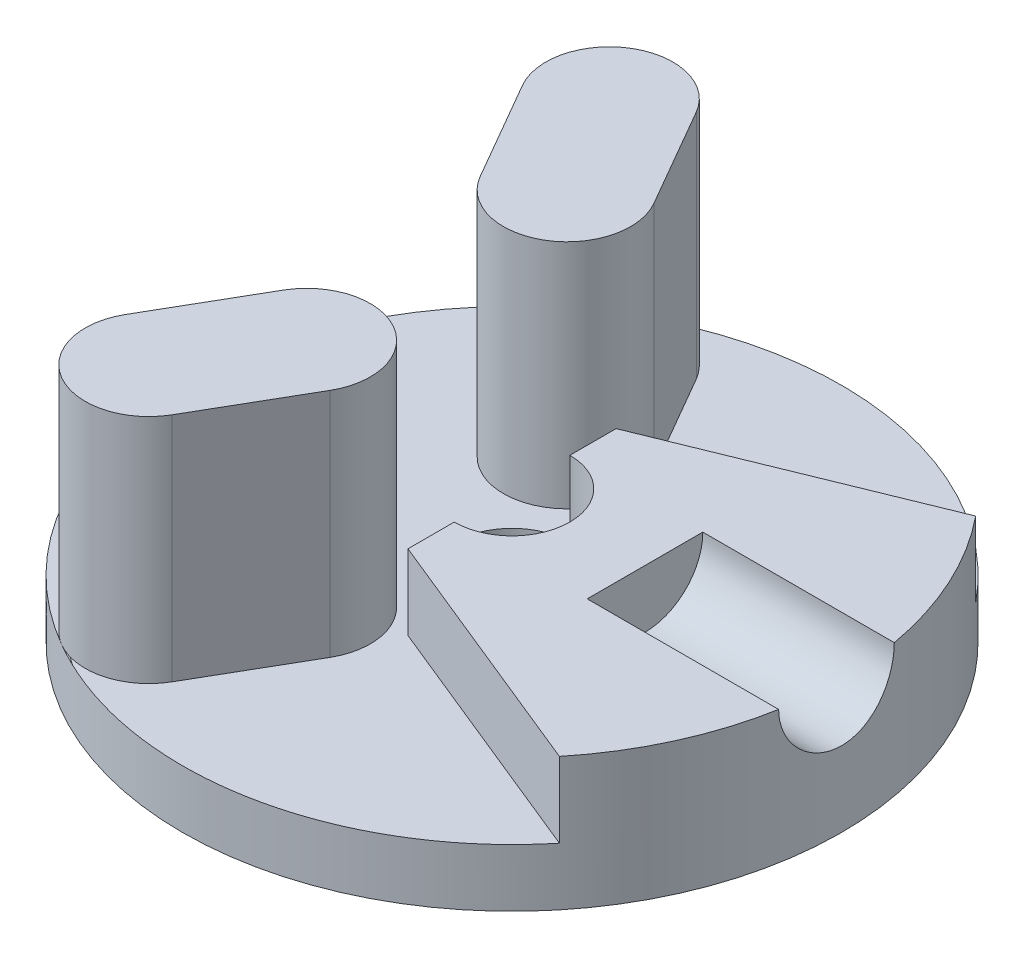
ISO-10303-21;
HEADER;
FILE_DESCRIPTION(('STEP AP214'),'2;1');
FILE_NAME('part.step','',(''),(''),'','','');
FILE_SCHEMA(('AUTOMOTIVE_DESIGN { 1 0 10303 214 1 1 1 1 }'));
ENDSEC;
DATA;
#1=APPLICATION_CONTEXT('core data for automotive mechanical design processes');
#2=APPLICATION_PROTOCOL_DEFINITION('international standard','automotive_design',2000,#1);
#3=PRODUCT_CONTEXT('',#1,'mechanical');
#4=PRODUCT('Part','Part','',(#3));
#5=PRODUCT_RELATED_PRODUCT_CATEGORY('part','',(#4));
#6=PRODUCT_DEFINITION_FORMATION('','',#4);
#7=PRODUCT_DEFINITION_CONTEXT('part definition',#1,'design');
#8=PRODUCT_DEFINITION('design','',#6,#7);
#9=PRODUCT_DEFINITION_SHAPE('','',#8);
#10=(LENGTH_UNIT() NAMED_UNIT(*) SI_UNIT(.MILLI.,.METRE.));
#11=(NAMED_UNIT(*) PLANE_ANGLE_UNIT() SI_UNIT($,.RADIAN.));
#12=(NAMED_UNIT(*) SI_UNIT($,.STERADIAN.) SOLID_ANGLE_UNIT());
#13=UNCERTAINTY_MEASURE_WITH_UNIT(LENGTH_MEASURE(1.E-05),#10,'distance_accuracy_value','');
#14=(GEOMETRIC_REPRESENTATION_CONTEXT(3) GLOBAL_UNCERTAINTY_ASSIGNED_CONTEXT((#13)) GLOBAL_UNIT_ASSIGNED_CONTEXT((#10,
#11,#12)) REPRESENTATION_CONTEXT('',''));
#15=CARTESIAN_POINT('',(0.,0.,0.));
#16=DIRECTION('',(0.,0.,1.));
#17=DIRECTION('',(1.,0.,0.));
#18=AXIS2_PLACEMENT_3D('',#15,#16,#17);
#19=CARTESIAN_POINT('',(0.,5.,0.));
#20=DIRECTION('',(0.,1.,0.));
#21=DIRECTION('',(0.,0.,1.));
#22=AXIS2_PLACEMENT_3D('',#19,#20,#21);
#23=PLANE('',#22);
#24=DIRECTION('',(0.500000000000004,0.,-0.866025403784436));
#25=VECTOR('',#24,1.);
#26=CARTESIAN_POINT('',(-6.73686027918569,5.,22.6685842870421));
#27=LINE('',#26,#25);
#28=CARTESIAN_POINT('',(-6.73686027918569,5.,22.6685842870421));
#29=VERTEX_POINT('',#28);
#30=CARTESIAN_POINT('',(-1.73686027918565,5.,14.0083302491977));
#31=VERTEX_POINT('',#30);
#32=EDGE_CURVE('E355',#29,#31,#27,.T.);
#33=ORIENTED_EDGE('',*,*,#32,.F.);
#34=CARTESIAN_POINT('',(-11.5000000000001,5.,19.918584287042));
#35=DIRECTION('',(0.,1.,0.));
#36=DIRECTION('',(0.,0.,-1.));
#37=AXIS2_PLACEMENT_3D('',#34,#35,#36);
#38=CIRCLE('',#37,5.5);
#39=CARTESIAN_POINT('',(-14.2500000000001,5.,24.6817240078564));
#40=VERTEX_POINT('',#39);
#41=EDGE_CURVE('E181',#40,#29,#38,.T.);
#42=ORIENTED_EDGE('',*,*,#41,.F.);
#43=CARTESIAN_POINT('',(0.,5.,0.));
#44=DIRECTION('',(0.,1.,0.));
#45=DIRECTION('',(0.,0.,1.));
#46=AXIS2_PLACEMENT_3D('',#43,#44,#45);
#47=CIRCLE('',#46,28.5);
#48=CARTESIAN_POINT('',(22.0963797939844,5.,18.));
#49=VERTEX_POINT('',#48);
#50=EDGE_CURVE('E275',#40,#49,#47,.T.);
#51=ORIENTED_EDGE('',*,*,#50,.T.);
#52=DIRECTION('',(0.926124996899135,0.,0.377216768077159));
#53=VECTOR('',#52,1.);
#54=CARTESIAN_POINT('',(0.,5.,9.));
#55=LINE('',#54,#53);
#56=CARTESIAN_POINT('',(0.,5.,9.));
#57=VERTEX_POINT('',#56);
#58=EDGE_CURVE('E406',#57,#49,#55,.T.);
#59=ORIENTED_EDGE('',*,*,#58,.F.);
#60=DIRECTION('',(0.,0.,1.));
#61=VECTOR('',#60,1.);
#62=CARTESIAN_POINT('',(0.,5.,9.));
#63=LINE('',#62,#61);
#64=CARTESIAN_POINT('',(0.,5.,5.));
#65=VERTEX_POINT('',#64);
#66=EDGE_CURVE('E403',#65,#57,#63,.T.);
#67=ORIENTED_EDGE('',*,*,#66,.F.);
#68=CARTESIAN_POINT('',(0.,5.,0.));
#69=DIRECTION('',(0.,1.,0.));
#70=DIRECTION('',(0.,0.,1.));
#71=AXIS2_PLACEMENT_3D('',#68,#69,#70);
#72=CIRCLE('',#71,5.);
#73=CARTESIAN_POINT('',(0.,5.,-5.));
#74=VERTEX_POINT('',#73);
#75=EDGE_CURVE('E276',#74,#65,#72,.T.);
#76=ORIENTED_EDGE('',*,*,#75,.F.);
#77=DIRECTION('',(0.,0.,1.));
#78=VECTOR('',#77,1.);
#79=CARTESIAN_POINT('',(0.,5.,-5.));
#80=LINE('',#79,#78);
#81=CARTESIAN_POINT('',(0.,5.,-9.));
#82=VERTEX_POINT('',#81);
#83=EDGE_CURVE('E223',#82,#74,#80,.T.);
#84=ORIENTED_EDGE('',*,*,#83,.F.);
#85=DIRECTION('',(-0.926124996899135,0.,0.377216768077159));
#86=VECTOR('',#85,1.);
#87=CARTESIAN_POINT('',(0.,5.,-9.));
#88=LINE('',#87,#86);
#89=CARTESIAN_POINT('',(22.0963797939844,5.,-18.));
#90=VERTEX_POINT('',#89);
#91=EDGE_CURVE('E373',#90,#82,#88,.T.);
#92=ORIENTED_EDGE('',*,*,#91,.F.);
#93=CARTESIAN_POINT('',(-14.2500000000001,5.,-24.6817240078564));
#94=VERTEX_POINT('',#93);
#95=EDGE_CURVE('E280',#90,#94,#47,.T.);
#96=ORIENTED_EDGE('',*,*,#95,.T.);
#97=CARTESIAN_POINT('',(-11.5000000000001,5.,-19.918584287042));
#98=DIRECTION('',(0.,1.,0.));
#99=DIRECTION('',(0.,0.,1.));
#100=AXIS2_PLACEMENT_3D('',#97,#98,#99);
#101=CIRCLE('',#100,5.5);
#102=CARTESIAN_POINT('',(-6.73686027918569,5.,-22.6685842870421));
#103=VERTEX_POINT('',#102);
#104=EDGE_CURVE('E184',#103,#94,#101,.T.);
#105=ORIENTED_EDGE('',*,*,#104,.F.);
#106=DIRECTION('',(-0.500000000000004,0.,-0.866025403784436));
#107=VECTOR('',#106,1.);
#108=CARTESIAN_POINT('',(-6.73686027918569,5.,-22.6685842870421));
#109=LINE('',#108,#107);
#110=CARTESIAN_POINT('',(-1.73686027918565,5.,-14.0083302491977));
#111=VERTEX_POINT('',#110);
#112=EDGE_CURVE('E193',#111,#103,#109,.T.);
#113=ORIENTED_EDGE('',*,*,#112,.F.);
#114=CARTESIAN_POINT('',(-6.50000000000006,5.,-11.2583302491977));
#115=DIRECTION('',(0.,1.,0.));
#116=DIRECTION('',(0.,0.,1.));
#117=AXIS2_PLACEMENT_3D('',#114,#115,#116);
#118=CIRCLE('',#117,5.5);
#119=CARTESIAN_POINT('',(-11.2631397208145,5.,-8.50833024919765));
#120=VERTEX_POINT('',#119);
#121=EDGE_CURVE('E202',#120,#111,#118,.T.);
#122=ORIENTED_EDGE('',*,*,#121,.F.);
#123=DIRECTION('',(0.500000000000004,0.,0.866025403784436));
#124=VECTOR('',#123,1.);
#125=CARTESIAN_POINT('',(-16.2631397208145,5.,-17.168584287042));
#126=LINE('',#125,#124);
#127=CARTESIAN_POINT('',(-16.2631397208145,5.,-17.168584287042));
#128=VERTEX_POINT('',#127);
#129=EDGE_CURVE('E200',#128,#120,#126,.T.);
#130=ORIENTED_EDGE('',*,*,#129,.F.);
#131=EDGE_CURVE('E182',#94,#128,#101,.T.);
#132=ORIENTED_EDGE('',*,*,#131,.F.);
#133=EDGE_CURVE('E278',#94,#40,#47,.T.);
#134=ORIENTED_EDGE('',*,*,#133,.T.);
#135=CARTESIAN_POINT('',(-16.2631397208145,5.,17.168584287042));
#136=VERTEX_POINT('',#135);
#137=EDGE_CURVE('E353',#136,#40,#38,.T.);
#138=ORIENTED_EDGE('',*,*,#137,.F.);
#139=DIRECTION('',(-0.500000000000004,0.,0.866025403784436));
#140=VECTOR('',#139,1.);
#141=CARTESIAN_POINT('',(-16.2631397208145,5.,17.168584287042));
#142=LINE('',#141,#140);
#143=CARTESIAN_POINT('',(-11.2631397208145,5.,8.50833024919765));
#144=VERTEX_POINT('',#143);
#145=EDGE_CURVE('E177',#144,#136,#142,.T.);
#146=ORIENTED_EDGE('',*,*,#145,.F.);
#147=CARTESIAN_POINT('',(-6.50000000000006,5.,11.2583302491977));
#148=DIRECTION('',(0.,1.,0.));
#149=DIRECTION('',(0.,0.,-1.));
#150=AXIS2_PLACEMENT_3D('',#147,#148,#149);
#151=CIRCLE('',#150,5.5);
#152=EDGE_CURVE('E357',#31,#144,#151,.T.);
#153=ORIENTED_EDGE('',*,*,#152,.F.);
#154=EDGE_LOOP('',(#33,#42,#51,#59,#67,#76,#84,#92,#96,#105,#113,#122,#130,#132,#134,#138,#146,#153));
#155=FACE_BOUND('',#154,.T.);
#156=ADVANCED_FACE('F35',(#155),#23,.T.);
#157=CARTESIAN_POINT('',(0.,0.,0.));
#158=DIRECTION('',(0.,1.,0.));
#159=DIRECTION('',(0.,0.,1.));
#160=AXIS2_PLACEMENT_3D('',#157,#158,#159);
#161=PLANE('',#160);
#162=CARTESIAN_POINT('',(0.,0.,0.));
#163=DIRECTION('',(0.,1.,0.));
#164=DIRECTION('',(0.,0.,1.));
#165=AXIS2_PLACEMENT_3D('',#162,#163,#164);
#166=CIRCLE('',#165,13.);
#167=CARTESIAN_POINT('',(0.,0.,13.));
#168=VERTEX_POINT('',#167);
#169=EDGE_CURVE('E270',#168,#168,#166,.T.);
#170=ORIENTED_EDGE('',*,*,#169,.T.);
#171=EDGE_LOOP('',(#170));
#172=FACE_BOUND('',#171,.T.);
#173=CARTESIAN_POINT('',(0.,0.,0.));
#174=DIRECTION('',(0.,1.,0.));
#175=DIRECTION('',(0.,0.,1.));
#176=AXIS2_PLACEMENT_3D('',#173,#174,#175);
#177=CIRCLE('',#176,28.5);
#178=CARTESIAN_POINT('',(0.,0.,28.5));
#179=VERTEX_POINT('',#178);
#180=EDGE_CURVE('E273',#179,#179,#177,.T.);
#181=ORIENTED_EDGE('',*,*,#180,.F.);
#182=EDGE_LOOP('',(#181));
#183=FACE_BOUND('',#182,.T.);
#184=ADVANCED_FACE('F259',(#172,#183),#161,.F.);
#185=CARTESIAN_POINT('',(0.,5.,0.));
#186=DIRECTION('',(0.,-1.,0.));
#187=DIRECTION('',(0.,0.,-1.));
#188=AXIS2_PLACEMENT_3D('',#185,#186,#187);
#189=CYLINDRICAL_SURFACE('',#188,28.5);
#190=CARTESIAN_POINT('',(0.,11.5,0.));
#191=DIRECTION('',(0.,1.,0.));
#192=DIRECTION('',(0.,0.,1.));
#193=AXIS2_PLACEMENT_3D('',#190,#191,#192);
#194=CIRCLE('',#193,28.5);
#195=CARTESIAN_POINT('',(28.0579756931964,11.5,-5.));
#196=VERTEX_POINT('',#195);
#197=CARTESIAN_POINT('',(22.0963797939844,11.5,-18.));
#198=VERTEX_POINT('',#197);
#199=EDGE_CURVE('E416',#196,#198,#194,.T.);
#200=ORIENTED_EDGE('',*,*,#199,.F.);
#201=CARTESIAN_POINT('',(28.0579756931964,11.5,-5.));
#202=CARTESIAN_POINT('',(28.0579648638318,11.360526994724,-5.0000163124846));
#203=CARTESIAN_POINT('',(28.0590152822352,11.2210577988714,-4.99416489188671));
#204=CARTESIAN_POINT('',(28.0631600797332,10.943138792684,-4.97084552817621));
#205=CARTESIAN_POINT('',(28.0662542424666,10.8046888760117,-4.95337881471612));
#206=CARTESIAN_POINT('',(28.074402592817,10.529973377533,-4.90697869364326));
#207=CARTESIAN_POINT('',(28.0794541635008,10.3937051311972,-4.87806059469441));
#208=CARTESIAN_POINT('',(28.0913669437331,10.1241297146742,-4.80898519582574));
#209=CARTESIAN_POINT('',(28.0982281537067,9.99082254518268,-4.76882789326572));
#210=CARTESIAN_POINT('',(28.1135628534791,9.7281032045944,-4.67757627787332));
#211=CARTESIAN_POINT('',(28.122036334852,9.59869101314617,-4.62648202219851));
#212=CARTESIAN_POINT('',(28.1403563982133,9.34460637870289,-4.51371294025757));
#213=CARTESIAN_POINT('',(28.1502034876117,9.21993570898086,-4.4520342021426));
#214=CARTESIAN_POINT('',(28.1709859770223,8.97627592026768,-4.31857679659606));
#215=CARTESIAN_POINT('',(28.1819209967216,8.85728483721184,-4.24680165500476));
#216=CARTESIAN_POINT('',(28.2045801238479,8.62569525866888,-4.09361148706889));
#217=CARTESIAN_POINT('',(28.2163045243476,8.51309916636597,-4.01219287178833));
#218=CARTESIAN_POINT('',(28.2403243668498,8.29408670612832,-3.83949833722571));
#219=CARTESIAN_POINT('',(28.2526241024637,8.18773747704034,-3.74813785854422));
#220=CARTESIAN_POINT('',(28.2773511421524,7.98305311341927,-3.55678505983657));
#221=CARTESIAN_POINT('',(28.289778491785,7.88472096147684,-3.45678955555584));
#222=CARTESIAN_POINT('',(28.3144060889387,7.69680803378986,-3.2489011585382));
#223=CARTESIAN_POINT('',(28.3266063842224,7.607225400283,-3.14100995082292));
#224=CARTESIAN_POINT('',(28.350446626853,7.43737781373927,-2.91800498399431));
#225=CARTESIAN_POINT('',(28.3620863659518,7.35711630813394,-2.80288857672626));
#226=CARTESIAN_POINT('',(28.3845458655861,7.20604365122085,-2.56551257206313));
#227=CARTESIAN_POINT('',(28.3953600280165,7.13529490080244,-2.44321271686518));
#228=CARTESIAN_POINT('',(28.4157841424983,7.00433817876625,-2.1929384927395));
#229=CARTESIAN_POINT('',(28.4253936439801,6.9441341477805,-2.06496202471935));
#230=CARTESIAN_POINT('',(28.4431255898793,6.83477698896186,-1.80434284598208));
#231=CARTESIAN_POINT('',(28.4512487496329,6.78561854257614,-1.67170241674209));
#232=CARTESIAN_POINT('',(28.4657843005092,6.69867595387172,-1.40260218360902));
#233=CARTESIAN_POINT('',(28.4721960695225,6.66089594710266,-1.26614101069568));
#234=CARTESIAN_POINT('',(28.4830615449565,6.59737064374594,-0.991874212988074));
#235=CARTESIAN_POINT('',(28.4875351929413,6.57150260046476,-0.854097955184966));
#236=CARTESIAN_POINT('',(28.4945013057089,6.53140269912826,-0.576816621516213));
#237=CARTESIAN_POINT('',(28.4969930822414,6.5171748833597,-0.437310962141805));
#238=CARTESIAN_POINT('',(28.5013571633257,6.49221609757098,-0.0177183366033674));
#239=CARTESIAN_POINT('',(28.5001308928114,6.49913751605374,0.263756991368908));
#240=CARTESIAN_POINT('',(28.4922241198011,6.54450612113548,0.680020915811708));
#241=CARTESIAN_POINT('',(28.4886105024651,6.56526899309383,0.817107828154563));
#242=CARTESIAN_POINT('',(28.4795089587374,6.6180801054283,1.08903096864885));
#243=CARTESIAN_POINT('',(28.4740216838269,6.65012442330223,1.22386796204028));
#244=CARTESIAN_POINT('',(28.4613177587417,6.72527805654388,1.49037642437863));
#245=CARTESIAN_POINT('',(28.4541004796303,6.76839139642036,1.62204672288552));
#246=CARTESIAN_POINT('',(28.4381399847402,6.86533799809669,1.88123387542564));
#247=CARTESIAN_POINT('',(28.4293973050975,6.91916749439958,2.00875217014882));
#248=CARTESIAN_POINT('',(28.4105723508957,7.03748409001497,2.25948517173191));
#249=CARTESIAN_POINT('',(28.4004831112805,7.10202705888384,2.38267298381295));
#250=CARTESIAN_POINT('',(28.379283095786,7.24107681544567,2.62313858593492));
#251=CARTESIAN_POINT('',(28.3681726820044,7.31558007554904,2.74041844821236));
#252=CARTESIAN_POINT('',(28.3452270245292,7.47407850455024,2.96837247210227));
#253=CARTESIAN_POINT('',(28.3333914937806,7.55807744380517,3.07904398295826));
#254=CARTESIAN_POINT('',(28.3093279082661,7.73493473598488,3.29295246566682));
#255=CARTESIAN_POINT('',(28.2970999937243,7.82778994687622,3.39619205157978));
#256=CARTESIAN_POINT('',(28.2724142355133,8.0230883034792,3.59595081085407));
#257=CARTESIAN_POINT('',(28.2599555370992,8.12564539109855,3.69235851692431));
#258=CARTESIAN_POINT('',(28.2353308338853,8.33850101953052,3.87616960026845));
#259=CARTESIAN_POINT('',(28.2231647248119,8.44879674584271,3.96357622293805));
#260=CARTESIAN_POINT('',(28.1994578976128,8.67648252939967,4.12886817998318));
#261=CARTESIAN_POINT('',(28.1879175985976,8.79387723226368,4.20674717641587));
#262=CARTESIAN_POINT('',(28.1658059952038,9.03484024895826,4.35233204473739));
#263=CARTESIAN_POINT('',(28.1552343248281,9.15840620348136,4.42004176532741));
#264=CARTESIAN_POINT('',(28.1353378315021,9.41118594186127,4.54497281058046));
#265=CARTESIAN_POINT('',(28.1260159426783,9.54041210303644,4.60216956660643));
#266=CARTESIAN_POINT('',(28.108924942379,9.80328151644042,4.70543075009463));
#267=CARTESIAN_POINT('',(28.1011552298836,9.93692303554214,4.75149948790077));
#268=CARTESIAN_POINT('',(28.0874018160245,10.207565990471,4.83213537036004));
#269=CARTESIAN_POINT('',(28.081416239583,10.3445637339016,4.86671459459275));
#270=CARTESIAN_POINT('',(28.0714011240581,10.6210081202551,4.924153708473));
#271=CARTESIAN_POINT('',(28.0673706485283,10.7604535575612,4.94701920900696));
#272=CARTESIAN_POINT('',(28.0622521219973,11.0001094786752,4.97595775333582));
#273=CARTESIAN_POINT('',(28.0606496216313,11.0999632015006,4.98497825876514));
#274=CARTESIAN_POINT('',(28.0585110518921,11.2998747945563,4.99699577324));
#275=CARTESIAN_POINT('',(28.0579731897824,11.3999320371127,5.00000290824326));
#276=CARTESIAN_POINT('',(28.0579756931964,11.5,5.));
#277=B_SPLINE_CURVE_WITH_KNOTS('',3,(#201,#202,#203,#204,#205,#206,#207,#208,#209,#210,#211,
#212,#213,#214,#215,#216,#217,#218,#219,#220,#221,#222,#223,#224,#225,#226,#227,#228,#229,#230,
#231,#232,#233,#234,#235,#236,#237,#238,#239,#240,#241,#242,#243,#244,#245,#246,#247,#248,#249,
#250,#251,#252,#253,#254,#255,#256,#257,#258,#259,#260,#261,#262,#263,#264,#265,#266,#267,#268,
#269,#270,#271,#272,#273,#274,#275,#276),.UNSPECIFIED.,.F.,.F.,(4,2,2,2,2,2,2,2,2,2,2,2,2,2,2,2,
2,2,2,2,2,2,2,2,2,2,2,2,2,2,2,2,2,2,2,2,2,4),(0.,0.418286691086618,0.836529107317457,
1.25421427798121,1.6718995467632,2.08958263273544,2.50742042121032,2.92511265402457,
3.34296082743039,3.764691401532,4.18657816271667,4.60837515016092,5.03032764628395,
5.4549254559048,5.87968160356831,6.3042327867649,6.72893808947175,7.14916329884729,
7.56953437741886,8.40932474150101,8.82505003604402,9.24063092750859,9.65636313164557,
10.0719495107389,10.4897754441435,10.9074537881942,11.3252985621305,11.7429956404013,
12.1664160697575,12.5896832937911,13.01323056896,13.4366171407456,13.8609809176985,
14.2851800563916,14.70893178869,15.1324803532107,15.4331232306924,15.7332594257213),.UNSPECIFIED.);
#278=CARTESIAN_POINT('',(28.0579756931964,11.5,5.));
#279=VERTEX_POINT('',#278);
#280=EDGE_CURVE('E216',#196,#279,#277,.T.);
#281=ORIENTED_EDGE('',*,*,#280,.T.);
#282=CARTESIAN_POINT('',(22.0963797939844,11.5,18.));
#283=VERTEX_POINT('',#282);
#284=EDGE_CURVE('E417',#283,#279,#194,.T.);
#285=ORIENTED_EDGE('',*,*,#284,.F.);
#286=DIRECTION('',(0.,-1.,0.));
#287=VECTOR('',#286,1.);
#288=CARTESIAN_POINT('',(22.0963797939844,11.5,18.));
#289=LINE('',#288,#287);
#290=EDGE_CURVE('E381',#283,#49,#289,.T.);
#291=ORIENTED_EDGE('',*,*,#290,.T.);
#292=ORIENTED_EDGE('',*,*,#50,.F.);
#293=ORIENTED_EDGE('',*,*,#133,.F.);
#294=ORIENTED_EDGE('',*,*,#95,.F.);
#295=DIRECTION('',(0.,-1.,0.));
#296=VECTOR('',#295,1.);
#297=CARTESIAN_POINT('',(22.0963797939844,11.5,-18.));
#298=LINE('',#297,#296);
#299=EDGE_CURVE('E376',#198,#90,#298,.T.);
#300=ORIENTED_EDGE('',*,*,#299,.F.);
#301=EDGE_LOOP('',(#200,#281,#285,#291,#292,#293,#294,#300));
#302=FACE_BOUND('',#301,.T.);
#303=ORIENTED_EDGE('',*,*,#180,.T.);
#304=EDGE_LOOP('',(#303));
#305=FACE_BOUND('',#304,.T.);
#306=ADVANCED_FACE('F37',(#302,#305),#189,.T.);
#307=CARTESIAN_POINT('',(0.,5.,0.));
#308=DIRECTION('',(0.,-1.,0.));
#309=DIRECTION('',(0.,0.,-1.));
#310=AXIS2_PLACEMENT_3D('',#307,#308,#309);
#311=CYLINDRICAL_SURFACE('',#310,5.);
#312=CARTESIAN_POINT('',(0.,4.,0.));
#313=DIRECTION('',(0.,1.,0.));
#314=DIRECTION('',(0.,0.,1.));
#315=AXIS2_PLACEMENT_3D('',#312,#313,#314);
#316=CIRCLE('',#315,5.);
#317=CARTESIAN_POINT('',(0.,4.,5.));
#318=VERTEX_POINT('',#317);
#319=EDGE_CURVE('E40',#318,#318,#316,.T.);
#320=ORIENTED_EDGE('',*,*,#319,.F.);
#321=EDGE_LOOP('',(#320));
#322=FACE_BOUND('',#321,.T.);
#323=ORIENTED_EDGE('',*,*,#75,.T.);
#324=DIRECTION('',(0.,-1.,0.));
#325=VECTOR('',#324,1.);
#326=CARTESIAN_POINT('',(0.,11.5,5.));
#327=LINE('',#326,#325);
#328=CARTESIAN_POINT('',(0.,11.5,5.));
#329=VERTEX_POINT('',#328);
#330=EDGE_CURVE('E392',#329,#65,#327,.T.);
#331=ORIENTED_EDGE('',*,*,#330,.F.);
#332=CARTESIAN_POINT('',(0.,11.5,0.));
#333=DIRECTION('',(0.,-1.,0.));
#334=DIRECTION('',(0.,0.,1.));
#335=AXIS2_PLACEMENT_3D('',#332,#333,#334);
#336=CIRCLE('',#335,5.);
#337=CARTESIAN_POINT('',(0.,11.5,-5.));
#338=VERTEX_POINT('',#337);
#339=EDGE_CURVE('E400',#338,#329,#336,.T.);
#340=ORIENTED_EDGE('',*,*,#339,.F.);
#341=DIRECTION('',(0.,-1.,0.));
#342=VECTOR('',#341,1.);
#343=CARTESIAN_POINT('',(0.,11.5,-5.));
#344=LINE('',#343,#342);
#345=EDGE_CURVE('E282',#338,#74,#344,.T.);
#346=ORIENTED_EDGE('',*,*,#345,.T.);
#347=EDGE_LOOP('',(#323,#331,#340,#346));
#348=FACE_BOUND('',#347,.T.);
#349=ADVANCED_FACE('F253',(#322,#348),#311,.F.);
#350=CARTESIAN_POINT('',(0.,11.5,-5.));
#351=DIRECTION('',(1.,0.,0.));
#352=DIRECTION('',(0.,0.,-1.));
#353=AXIS2_PLACEMENT_3D('',#350,#351,#352);
#354=PLANE('',#353);
#355=ORIENTED_EDGE('',*,*,#83,.T.);
#356=ORIENTED_EDGE('',*,*,#345,.F.);
#357=DIRECTION('',(0.,0.,1.));
#358=VECTOR('',#357,1.);
#359=CARTESIAN_POINT('',(0.,11.5,-5.));
#360=LINE('',#359,#358);
#361=CARTESIAN_POINT('',(0.,11.5,-9.));
#362=VERTEX_POINT('',#361);
#363=EDGE_CURVE('E224',#362,#338,#360,.T.);
#364=ORIENTED_EDGE('',*,*,#363,.F.);
#365=DIRECTION('',(0.,-1.,0.));
#366=VECTOR('',#365,1.);
#367=CARTESIAN_POINT('',(0.,11.5,-9.));
#368=LINE('',#367,#366);
#369=EDGE_CURVE('E382',#362,#82,#368,.T.);
#370=ORIENTED_EDGE('',*,*,#369,.T.);
#371=EDGE_LOOP('',(#355,#356,#364,#370));
#372=FACE_BOUND('',#371,.T.);
#373=ADVANCED_FACE('F249',(#372),#354,.F.);
#374=CARTESIAN_POINT('',(0.,11.5,9.));
#375=DIRECTION('',(1.,0.,0.));
#376=DIRECTION('',(0.,0.,-1.));
#377=AXIS2_PLACEMENT_3D('',#374,#375,#376);
#378=PLANE('',#377);
#379=ORIENTED_EDGE('',*,*,#66,.T.);
#380=DIRECTION('',(0.,-1.,0.));
#381=VECTOR('',#380,1.);
#382=CARTESIAN_POINT('',(0.,11.5,9.));
#383=LINE('',#382,#381);
#384=CARTESIAN_POINT('',(0.,11.5,9.));
#385=VERTEX_POINT('',#384);
#386=EDGE_CURVE('E385',#385,#57,#383,.T.);
#387=ORIENTED_EDGE('',*,*,#386,.F.);
#388=DIRECTION('',(0.,0.,1.));
#389=VECTOR('',#388,1.);
#390=CARTESIAN_POINT('',(0.,11.5,9.));
#391=LINE('',#390,#389);
#392=EDGE_CURVE('E412',#329,#385,#391,.T.);
#393=ORIENTED_EDGE('',*,*,#392,.F.);
#394=ORIENTED_EDGE('',*,*,#330,.T.);
#395=EDGE_LOOP('',(#379,#387,#393,#394));
#396=FACE_BOUND('',#395,.T.);
#397=ADVANCED_FACE('F245',(#396),#378,.F.);
#398=CARTESIAN_POINT('',(0.,11.5,9.));
#399=DIRECTION('',(0.377216768077159,0.,-0.926124996899135));
#400=DIRECTION('',(-0.926124996899135,0.,-0.377216768077159));
#401=AXIS2_PLACEMENT_3D('',#398,#399,#400);
#402=PLANE('',#401);
#403=ORIENTED_EDGE('',*,*,#58,.T.);
#404=ORIENTED_EDGE('',*,*,#290,.F.);
#405=DIRECTION('',(0.926124996899135,0.,0.377216768077159));
#406=VECTOR('',#405,1.);
#407=CARTESIAN_POINT('',(0.,11.5,9.));
#408=LINE('',#407,#406);
#409=EDGE_CURVE('E413',#385,#283,#408,.T.);
#410=ORIENTED_EDGE('',*,*,#409,.F.);
#411=ORIENTED_EDGE('',*,*,#386,.T.);
#412=EDGE_LOOP('',(#403,#404,#410,#411));
#413=FACE_BOUND('',#412,.T.);
#414=ADVANCED_FACE('F241',(#413),#402,.F.);
#415=CARTESIAN_POINT('',(0.,11.5,-9.));
#416=DIRECTION('',(0.377216768077159,0.,0.926124996899135));
#417=DIRECTION('',(0.926124996899135,0.,-0.377216768077159));
#418=AXIS2_PLACEMENT_3D('',#415,#416,#417);
#419=PLANE('',#418);
#420=ORIENTED_EDGE('',*,*,#91,.T.);
#421=ORIENTED_EDGE('',*,*,#369,.F.);
#422=DIRECTION('',(-0.926124996899135,0.,0.377216768077159));
#423=VECTOR('',#422,1.);
#424=CARTESIAN_POINT('',(0.,11.5,-9.));
#425=LINE('',#424,#423);
#426=EDGE_CURVE('E380',#198,#362,#425,.T.);
#427=ORIENTED_EDGE('',*,*,#426,.F.);
#428=ORIENTED_EDGE('',*,*,#299,.T.);
#429=EDGE_LOOP('',(#420,#421,#427,#428));
#430=FACE_BOUND('',#429,.T.);
#431=ADVANCED_FACE('F237',(#430),#419,.F.);
#432=CARTESIAN_POINT('',(0.,11.5,0.));
#433=DIRECTION('',(0.,1.,0.));
#434=DIRECTION('',(0.,0.,1.));
#435=AXIS2_PLACEMENT_3D('',#432,#433,#434);
#436=PLANE('',#435);
#437=DIRECTION('',(1.,0.,0.));
#438=VECTOR('',#437,1.);
#439=CARTESIAN_POINT('',(11.5,11.5,5.));
#440=LINE('',#439,#438);
#441=CARTESIAN_POINT('',(11.5,11.5,5.));
#442=VERTEX_POINT('',#441);
#443=EDGE_CURVE('E11',#442,#279,#440,.T.);
#444=ORIENTED_EDGE('',*,*,#443,.F.);
#445=DIRECTION('',(0.,0.,-1.));
#446=VECTOR('',#445,1.);
#447=CARTESIAN_POINT('',(11.5,11.5,0.));
#448=LINE('',#447,#446);
#449=CARTESIAN_POINT('',(11.5,11.5,-5.));
#450=VERTEX_POINT('',#449);
#451=EDGE_CURVE('E285',#442,#450,#448,.T.);
#452=ORIENTED_EDGE('',*,*,#451,.T.);
#453=DIRECTION('',(1.,0.,0.));
#454=VECTOR('',#453,1.);
#455=CARTESIAN_POINT('',(11.5,11.5,-5.));
#456=LINE('',#455,#454);
#457=EDGE_CURVE('E45',#196,#450,#456,.F.);
#458=ORIENTED_EDGE('',*,*,#457,.F.);
#459=ORIENTED_EDGE('',*,*,#199,.T.);
#460=ORIENTED_EDGE('',*,*,#426,.T.);
#461=ORIENTED_EDGE('',*,*,#363,.T.);
#462=ORIENTED_EDGE('',*,*,#339,.T.);
#463=ORIENTED_EDGE('',*,*,#392,.T.);
#464=ORIENTED_EDGE('',*,*,#409,.T.);
#465=ORIENTED_EDGE('',*,*,#284,.T.);
#466=EDGE_LOOP('',(#444,#452,#458,#459,#460,#461,#462,#463,#464,#465));
#467=FACE_BOUND('',#466,.T.);
#468=ADVANCED_FACE('F232',(#467),#436,.T.);
#469=CARTESIAN_POINT('',(11.5,11.5,0.));
#470=DIRECTION('',(1.,0.,0.));
#471=DIRECTION('',(0.,0.,-1.));
#472=AXIS2_PLACEMENT_3D('',#469,#470,#471);
#473=CYLINDRICAL_SURFACE('',#472,5.);
#474=ORIENTED_EDGE('',*,*,#443,.T.);
#475=ORIENTED_EDGE('',*,*,#280,.F.);
#476=ORIENTED_EDGE('',*,*,#457,.T.);
#477=CARTESIAN_POINT('',(11.5,11.5,0.));
#478=DIRECTION('',(1.,0.,0.));
#479=DIRECTION('',(0.,0.,-1.));
#480=AXIS2_PLACEMENT_3D('',#477,#478,#479);
#481=CIRCLE('',#480,5.);
#482=EDGE_CURVE('E214',#442,#450,#481,.T.);
#483=ORIENTED_EDGE('',*,*,#482,.F.);
#484=EDGE_LOOP('',(#474,#475,#476,#483));
#485=FACE_BOUND('',#484,.T.);
#486=ADVANCED_FACE('F226',(#485),#473,.F.);
#487=CARTESIAN_POINT('',(11.5,11.5,0.));
#488=DIRECTION('',(1.,0.,0.));
#489=DIRECTION('',(0.,0.,-1.));
#490=AXIS2_PLACEMENT_3D('',#487,#488,#489);
#491=PLANE('',#490);
#492=ORIENTED_EDGE('',*,*,#482,.T.);
#493=ORIENTED_EDGE('',*,*,#451,.F.);
#494=EDGE_LOOP('',(#492,#493));
#495=FACE_BOUND('',#494,.T.);
#496=ADVANCED_FACE('F231',(#495),#491,.T.);
#497=CARTESIAN_POINT('',(-11.5000000000001,25.,-19.918584287042));
#498=DIRECTION('',(0.,-1.,0.));
#499=DIRECTION('',(0.,0.,-1.));
#500=AXIS2_PLACEMENT_3D('',#497,#498,#499);
#501=CYLINDRICAL_SURFACE('',#500,5.5);
#502=ORIENTED_EDGE('',*,*,#104,.T.);
#503=ORIENTED_EDGE('',*,*,#131,.T.);
#504=DIRECTION('',(0.,-1.,0.));
#505=VECTOR('',#504,1.);
#506=CARTESIAN_POINT('',(-16.2631397208145,25.,-17.168584287042));
#507=LINE('',#506,#505);
#508=CARTESIAN_POINT('',(-16.2631397208145,25.,-17.168584287042));
#509=VERTEX_POINT('',#508);
#510=EDGE_CURVE('E211',#509,#128,#507,.T.);
#511=ORIENTED_EDGE('',*,*,#510,.F.);
#512=CARTESIAN_POINT('',(-11.5000000000001,25.,-19.918584287042));
#513=DIRECTION('',(0.,1.,0.));
#514=DIRECTION('',(0.,0.,1.));
#515=AXIS2_PLACEMENT_3D('',#512,#513,#514);
#516=CIRCLE('',#515,5.5);
#517=CARTESIAN_POINT('',(-6.73686027918569,25.,-22.6685842870421));
#518=VERTEX_POINT('',#517);
#519=EDGE_CURVE('E189',#518,#509,#516,.T.);
#520=ORIENTED_EDGE('',*,*,#519,.F.);
#521=DIRECTION('',(0.,-1.,0.));
#522=VECTOR('',#521,1.);
#523=CARTESIAN_POINT('',(-6.73686027918569,25.,-22.6685842870421));
#524=LINE('',#523,#522);
#525=EDGE_CURVE('E198',#518,#103,#524,.T.);
#526=ORIENTED_EDGE('',*,*,#525,.T.);
#527=EDGE_LOOP('',(#502,#503,#511,#520,#526));
#528=FACE_BOUND('',#527,.T.);
#529=ADVANCED_FACE('F296',(#528),#501,.T.);
#530=CARTESIAN_POINT('',(-16.2631397208145,25.,-17.168584287042));
#531=DIRECTION('',(0.866025403784437,0.,-0.500000000000004));
#532=DIRECTION('',(-0.500000000000004,0.,-0.866025403784437));
#533=AXIS2_PLACEMENT_3D('',#530,#531,#532);
#534=PLANE('',#533);
#535=ORIENTED_EDGE('',*,*,#129,.T.);
#536=DIRECTION('',(0.,-1.,0.));
#537=VECTOR('',#536,1.);
#538=CARTESIAN_POINT('',(-11.2631397208145,25.,-8.50833024919765));
#539=LINE('',#538,#537);
#540=CARTESIAN_POINT('',(-11.2631397208145,25.,-8.50833024919765));
#541=VERTEX_POINT('',#540);
#542=EDGE_CURVE('E208',#541,#120,#539,.T.);
#543=ORIENTED_EDGE('',*,*,#542,.F.);
#544=DIRECTION('',(0.500000000000004,0.,0.866025403784436));
#545=VECTOR('',#544,1.);
#546=CARTESIAN_POINT('',(-16.2631397208145,25.,-17.168584287042));
#547=LINE('',#546,#545);
#548=EDGE_CURVE('E192',#509,#541,#547,.T.);
#549=ORIENTED_EDGE('',*,*,#548,.F.);
#550=ORIENTED_EDGE('',*,*,#510,.T.);
#551=EDGE_LOOP('',(#535,#543,#549,#550));
#552=FACE_BOUND('',#551,.T.);
#553=ADVANCED_FACE('F300',(#552),#534,.F.);
#554=CARTESIAN_POINT('',(-6.50000000000006,25.,-11.2583302491977));
#555=DIRECTION('',(0.,-1.,0.));
#556=DIRECTION('',(0.,0.,-1.));
#557=AXIS2_PLACEMENT_3D('',#554,#555,#556);
#558=CYLINDRICAL_SURFACE('',#557,5.5);
#559=ORIENTED_EDGE('',*,*,#121,.T.);
#560=DIRECTION('',(0.,-1.,0.));
#561=VECTOR('',#560,1.);
#562=CARTESIAN_POINT('',(-1.73686027918565,25.,-14.0083302491977));
#563=LINE('',#562,#561);
#564=CARTESIAN_POINT('',(-1.73686027918565,25.,-14.0083302491977));
#565=VERTEX_POINT('',#564);
#566=EDGE_CURVE('E60',#565,#111,#563,.T.);
#567=ORIENTED_EDGE('',*,*,#566,.F.);
#568=CARTESIAN_POINT('',(-6.50000000000006,25.,-11.2583302491977));
#569=DIRECTION('',(0.,1.,0.));
#570=DIRECTION('',(0.,0.,1.));
#571=AXIS2_PLACEMENT_3D('',#568,#569,#570);
#572=CIRCLE('',#571,5.5);
#573=EDGE_CURVE('E195',#541,#565,#572,.T.);
#574=ORIENTED_EDGE('',*,*,#573,.F.);
#575=ORIENTED_EDGE('',*,*,#542,.T.);
#576=EDGE_LOOP('',(#559,#567,#574,#575));
#577=FACE_BOUND('',#576,.T.);
#578=ADVANCED_FACE('F305',(#577),#558,.T.);
#579=CARTESIAN_POINT('',(-6.73686027918569,25.,-22.6685842870421));
#580=DIRECTION('',(-0.866025403784436,0.,0.500000000000004));
#581=DIRECTION('',(0.500000000000004,0.,0.866025403784436));
#582=AXIS2_PLACEMENT_3D('',#579,#580,#581);
#583=PLANE('',#582);
#584=ORIENTED_EDGE('',*,*,#112,.T.);
#585=ORIENTED_EDGE('',*,*,#525,.F.);
#586=DIRECTION('',(-0.500000000000004,0.,-0.866025403784436));
#587=VECTOR('',#586,1.);
#588=CARTESIAN_POINT('',(-6.73686027918569,25.,-22.6685842870421));
#589=LINE('',#588,#587);
#590=EDGE_CURVE('E197',#565,#518,#589,.T.);
#591=ORIENTED_EDGE('',*,*,#590,.F.);
#592=ORIENTED_EDGE('',*,*,#566,.T.);
#593=EDGE_LOOP('',(#584,#585,#591,#592));
#594=FACE_BOUND('',#593,.T.);
#595=ADVANCED_FACE('F311',(#594),#583,.F.);
#596=CARTESIAN_POINT('',(-11.5000000000001,25.,-19.918584287042));
#597=DIRECTION('',(0.,1.,0.));
#598=DIRECTION('',(0.,0.,1.));
#599=AXIS2_PLACEMENT_3D('',#596,#597,#598);
#600=PLANE('',#599);
#601=ORIENTED_EDGE('',*,*,#519,.T.);
#602=ORIENTED_EDGE('',*,*,#548,.T.);
#603=ORIENTED_EDGE('',*,*,#573,.T.);
#604=ORIENTED_EDGE('',*,*,#590,.T.);
#605=EDGE_LOOP('',(#601,#602,#603,#604));
#606=FACE_BOUND('',#605,.T.);
#607=ADVANCED_FACE('F315',(#606),#600,.T.);
#608=CARTESIAN_POINT('',(-11.5000000000001,25.,19.918584287042));
#609=DIRECTION('',(0.,-1.,0.));
#610=DIRECTION('',(0.,0.,-1.));
#611=AXIS2_PLACEMENT_3D('',#608,#609,#610);
#612=CYLINDRICAL_SURFACE('',#611,5.5);
#613=ORIENTED_EDGE('',*,*,#137,.T.);
#614=ORIENTED_EDGE('',*,*,#41,.T.);
#615=DIRECTION('',(0.,-1.,0.));
#616=VECTOR('',#615,1.);
#617=CARTESIAN_POINT('',(-6.73686027918569,25.,22.6685842870421));
#618=LINE('',#617,#616);
#619=CARTESIAN_POINT('',(-6.73686027918569,25.,22.6685842870421));
#620=VERTEX_POINT('',#619);
#621=EDGE_CURVE('E162',#620,#29,#618,.T.);
#622=ORIENTED_EDGE('',*,*,#621,.F.);
#623=CARTESIAN_POINT('',(-11.5000000000001,25.,19.918584287042));
#624=DIRECTION('',(0.,1.,0.));
#625=DIRECTION('',(0.,0.,-1.));
#626=AXIS2_PLACEMENT_3D('',#623,#624,#625);
#627=CIRCLE('',#626,5.5);
#628=CARTESIAN_POINT('',(-16.2631397208145,25.,17.168584287042));
#629=VERTEX_POINT('',#628);
#630=EDGE_CURVE('E169',#629,#620,#627,.T.);
#631=ORIENTED_EDGE('',*,*,#630,.F.);
#632=DIRECTION('',(0.,-1.,0.));
#633=VECTOR('',#632,1.);
#634=CARTESIAN_POINT('',(-16.2631397208145,25.,17.168584287042));
#635=LINE('',#634,#633);
#636=EDGE_CURVE('E352',#629,#136,#635,.T.);
#637=ORIENTED_EDGE('',*,*,#636,.T.);
#638=EDGE_LOOP('',(#613,#614,#622,#631,#637));
#639=FACE_BOUND('',#638,.T.);
#640=ADVANCED_FACE('F179',(#639),#612,.T.);
#641=CARTESIAN_POINT('',(-6.73686027918569,25.,22.6685842870421));
#642=DIRECTION('',(-0.866025403784436,0.,-0.500000000000004));
#643=DIRECTION('',(-0.500000000000004,0.,0.866025403784436));
#644=AXIS2_PLACEMENT_3D('',#641,#642,#643);
#645=PLANE('',#644);
#646=ORIENTED_EDGE('',*,*,#32,.T.);
#647=DIRECTION('',(0.,-1.,0.));
#648=VECTOR('',#647,1.);
#649=CARTESIAN_POINT('',(-1.73686027918565,25.,14.0083302491977));
#650=LINE('',#649,#648);
#651=CARTESIAN_POINT('',(-1.73686027918565,25.,14.0083302491977));
#652=VERTEX_POINT('',#651);
#653=EDGE_CURVE('E165',#652,#31,#650,.T.);
#654=ORIENTED_EDGE('',*,*,#653,.F.);
#655=DIRECTION('',(0.500000000000004,0.,-0.866025403784436));
#656=VECTOR('',#655,1.);
#657=CARTESIAN_POINT('',(-6.73686027918569,25.,22.6685842870421));
#658=LINE('',#657,#656);
#659=EDGE_CURVE('E158',#620,#652,#658,.T.);
#660=ORIENTED_EDGE('',*,*,#659,.F.);
#661=ORIENTED_EDGE('',*,*,#621,.T.);
#662=EDGE_LOOP('',(#646,#654,#660,#661));
#663=FACE_BOUND('',#662,.T.);
#664=ADVANCED_FACE('F160',(#663),#645,.F.);
#665=CARTESIAN_POINT('',(-6.50000000000006,25.,11.2583302491977));
#666=DIRECTION('',(0.,-1.,0.));
#667=DIRECTION('',(0.,0.,-1.));
#668=AXIS2_PLACEMENT_3D('',#665,#666,#667);
#669=CYLINDRICAL_SURFACE('',#668,5.5);
#670=ORIENTED_EDGE('',*,*,#152,.T.);
#671=DIRECTION('',(0.,-1.,0.));
#672=VECTOR('',#671,1.);
#673=CARTESIAN_POINT('',(-11.2631397208145,25.,8.50833024919765));
#674=LINE('',#673,#672);
#675=CARTESIAN_POINT('',(-11.2631397208145,25.,8.50833024919765));
#676=VERTEX_POINT('',#675);
#677=EDGE_CURVE('E52',#676,#144,#674,.T.);
#678=ORIENTED_EDGE('',*,*,#677,.F.);
#679=CARTESIAN_POINT('',(-6.50000000000006,25.,11.2583302491977));
#680=DIRECTION('',(0.,1.,0.));
#681=DIRECTION('',(0.,0.,-1.));
#682=AXIS2_PLACEMENT_3D('',#679,#680,#681);
#683=CIRCLE('',#682,5.5);
#684=EDGE_CURVE('E168',#652,#676,#683,.T.);
#685=ORIENTED_EDGE('',*,*,#684,.F.);
#686=ORIENTED_EDGE('',*,*,#653,.T.);
#687=EDGE_LOOP('',(#670,#678,#685,#686));
#688=FACE_BOUND('',#687,.T.);
#689=ADVANCED_FACE('F323',(#688),#669,.T.);
#690=CARTESIAN_POINT('',(-16.2631397208145,25.,17.168584287042));
#691=DIRECTION('',(0.866025403784437,0.,0.500000000000004));
#692=DIRECTION('',(0.500000000000004,0.,-0.866025403784437));
#693=AXIS2_PLACEMENT_3D('',#690,#691,#692);
#694=PLANE('',#693);
#695=ORIENTED_EDGE('',*,*,#145,.T.);
#696=ORIENTED_EDGE('',*,*,#636,.F.);
#697=DIRECTION('',(-0.500000000000004,0.,0.866025403784436));
#698=VECTOR('',#697,1.);
#699=CARTESIAN_POINT('',(-16.2631397208145,25.,17.168584287042));
#700=LINE('',#699,#698);
#701=EDGE_CURVE('E173',#676,#629,#700,.T.);
#702=ORIENTED_EDGE('',*,*,#701,.F.);
#703=ORIENTED_EDGE('',*,*,#677,.T.);
#704=EDGE_LOOP('',(#695,#696,#702,#703));
#705=FACE_BOUND('',#704,.T.);
#706=ADVANCED_FACE('F326',(#705),#694,.F.);
#707=CARTESIAN_POINT('',(-11.5000000000001,25.,19.918584287042));
#708=DIRECTION('',(0.,-1.,0.));
#709=DIRECTION('',(0.,0.,-1.));
#710=AXIS2_PLACEMENT_3D('',#707,#708,#709);
#711=PLANE('',#710);
#712=ORIENTED_EDGE('',*,*,#630,.T.);
#713=ORIENTED_EDGE('',*,*,#659,.T.);
#714=ORIENTED_EDGE('',*,*,#684,.T.);
#715=ORIENTED_EDGE('',*,*,#701,.T.);
#716=EDGE_LOOP('',(#712,#713,#714,#715));
#717=FACE_BOUND('',#716,.T.);
#718=ADVANCED_FACE('F172',(#717),#711,.F.);
#719=CARTESIAN_POINT('',(0.,4.,0.));
#720=DIRECTION('',(0.,-1.,0.));
#721=DIRECTION('',(0.,0.,-1.));
#722=AXIS2_PLACEMENT_3D('',#719,#720,#721);
#723=CYLINDRICAL_SURFACE('',#722,13.);
#724=CARTESIAN_POINT('',(0.,4.,0.));
#725=DIRECTION('',(0.,1.,0.));
#726=DIRECTION('',(0.,0.,1.));
#727=AXIS2_PLACEMENT_3D('',#724,#725,#726);
#728=CIRCLE('',#727,13.);
#729=CARTESIAN_POINT('',(0.,4.,13.));
#730=VERTEX_POINT('',#729);
#731=EDGE_CURVE('E346',#730,#730,#728,.T.);
#732=ORIENTED_EDGE('',*,*,#731,.T.);
#733=EDGE_LOOP('',(#732));
#734=FACE_BOUND('',#733,.T.);
#735=ORIENTED_EDGE('',*,*,#169,.F.);
#736=EDGE_LOOP('',(#735));
#737=FACE_BOUND('',#736,.T.);
#738=ADVANCED_FACE('F332',(#734,#737),#723,.F.);
#739=CARTESIAN_POINT('',(0.,4.,0.));
#740=DIRECTION('',(0.,1.,0.));
#741=DIRECTION('',(0.,0.,1.));
#742=AXIS2_PLACEMENT_3D('',#739,#740,#741);
#743=PLANE('',#742);
#744=ORIENTED_EDGE('',*,*,#319,.T.);
#745=EDGE_LOOP('',(#744));
#746=FACE_BOUND('',#745,.T.);
#747=ORIENTED_EDGE('',*,*,#731,.F.);
#748=EDGE_LOOP('',(#747));
#749=FACE_BOUND('',#748,.T.);
#750=ADVANCED_FACE('F335',(#746,#749),#743,.F.);
#751=CLOSED_SHELL('',(#156,#184,#306,#349,#373,#397,#414,#431,#468,#486,#496,#529,#553,#578,
#595,#607,#640,#664,#689,#706,#718,#738,#750));
#752=MANIFOLD_SOLID_BREP('B2',#751);
#753=ADVANCED_BREP_SHAPE_REPRESENTATION('',(#18,#752),#14);
#754=SHAPE_DEFINITION_REPRESENTATION(#9,#753);
ENDSEC;
END-ISO-10303-21;
